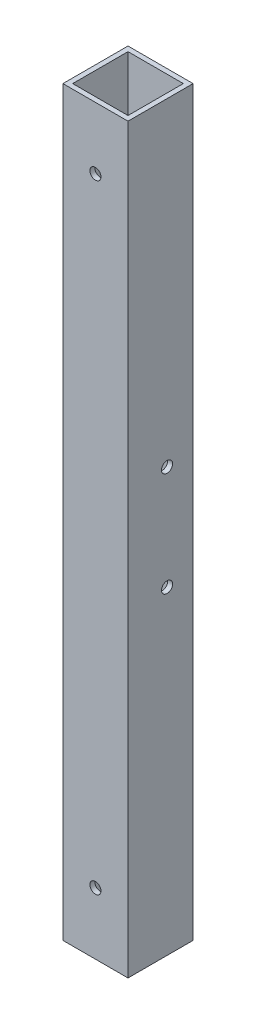
ISO-10303-21;
HEADER;
FILE_DESCRIPTION(('STEP AP214'),'2;1');
FILE_NAME('part.step','',(''),(''),'','','');
FILE_SCHEMA(('AUTOMOTIVE_DESIGN { 1 0 10303 214 1 1 1 1 }'));
ENDSEC;
DATA;
#1=APPLICATION_CONTEXT('core data for automotive mechanical design processes');
#2=APPLICATION_PROTOCOL_DEFINITION('international standard','automotive_design',2000,#1);
#3=PRODUCT_CONTEXT('',#1,'mechanical');
#4=PRODUCT('Part','Part','',(#3));
#5=PRODUCT_RELATED_PRODUCT_CATEGORY('part','',(#4));
#6=PRODUCT_DEFINITION_FORMATION('','',#4);
#7=PRODUCT_DEFINITION_CONTEXT('part definition',#1,'design');
#8=PRODUCT_DEFINITION('design','',#6,#7);
#9=PRODUCT_DEFINITION_SHAPE('','',#8);
#10=(LENGTH_UNIT() NAMED_UNIT(*) SI_UNIT(.MILLI.,.METRE.));
#11=(NAMED_UNIT(*) PLANE_ANGLE_UNIT() SI_UNIT($,.RADIAN.));
#12=(NAMED_UNIT(*) SI_UNIT($,.STERADIAN.) SOLID_ANGLE_UNIT());
#13=UNCERTAINTY_MEASURE_WITH_UNIT(LENGTH_MEASURE(1.E-05),#10,'distance_accuracy_value','');
#14=(GEOMETRIC_REPRESENTATION_CONTEXT(3) GLOBAL_UNCERTAINTY_ASSIGNED_CONTEXT((#13)) GLOBAL_UNIT_ASSIGNED_CONTEXT((#10,
#11,#12)) REPRESENTATION_CONTEXT('',''));
#15=CARTESIAN_POINT('',(0.,0.,0.));
#16=DIRECTION('',(0.,0.,1.));
#17=DIRECTION('',(1.,0.,0.));
#18=AXIS2_PLACEMENT_3D('',#15,#16,#17);
#19=CARTESIAN_POINT('',(-12.,-16.,-2.));
#20=DIRECTION('',(1.,0.,0.));
#21=DIRECTION('',(0.,0.,-1.));
#22=AXIS2_PLACEMENT_3D('',#19,#20,#21);
#23=CYLINDRICAL_SURFACE('',#22,1.7);
#24=DIRECTION('',(1.,0.,0.));
#25=VECTOR('',#24,1.);
#26=CARTESIAN_POINT('',(-12.,-16.,-3.7));
#27=LINE('',#26,#25);
#28=CARTESIAN_POINT('',(8.5,-16.,-3.7));
#29=VERTEX_POINT('',#28);
#30=CARTESIAN_POINT('',(10.,-16.,-3.7));
#31=VERTEX_POINT('',#30);
#32=EDGE_CURVE('E9',#29,#31,#27,.T.);
#33=ORIENTED_EDGE('',*,*,#32,.F.);
#34=CARTESIAN_POINT('',(8.5,-16.,-2.));
#35=DIRECTION('',(1.,0.,0.));
#36=DIRECTION('',(0.,0.,-1.));
#37=AXIS2_PLACEMENT_3D('',#34,#35,#36);
#38=CIRCLE('',#37,1.7);
#39=EDGE_CURVE('E225',#29,#29,#38,.T.);
#40=ORIENTED_EDGE('',*,*,#39,.F.);
#41=ORIENTED_EDGE('',*,*,#32,.T.);
#42=CARTESIAN_POINT('',(10.,-16.,-2.));
#43=DIRECTION('',(1.,0.,0.));
#44=DIRECTION('',(0.,0.,-1.));
#45=AXIS2_PLACEMENT_3D('',#42,#43,#44);
#46=CIRCLE('',#45,1.7);
#47=EDGE_CURVE('E277',#31,#31,#46,.T.);
#48=ORIENTED_EDGE('',*,*,#47,.T.);
#49=EDGE_LOOP('',(#33,#40,#41,#48));
#50=FACE_BOUND('',#49,.T.);
#51=ADVANCED_FACE('F14',(#50),#23,.F.);
#52=CARTESIAN_POINT('',(-12.,16.,-2.));
#53=DIRECTION('',(1.,0.,0.));
#54=DIRECTION('',(0.,0.,-1.));
#55=AXIS2_PLACEMENT_3D('',#52,#53,#54);
#56=CYLINDRICAL_SURFACE('',#55,1.7);
#57=DIRECTION('',(1.,0.,0.));
#58=VECTOR('',#57,1.);
#59=CARTESIAN_POINT('',(-12.,16.,-3.7));
#60=LINE('',#59,#58);
#61=CARTESIAN_POINT('',(8.5,16.,-3.7));
#62=VERTEX_POINT('',#61);
#63=CARTESIAN_POINT('',(10.,16.,-3.7));
#64=VERTEX_POINT('',#63);
#65=EDGE_CURVE('E24',#62,#64,#60,.T.);
#66=ORIENTED_EDGE('',*,*,#65,.F.);
#67=CARTESIAN_POINT('',(8.5,16.,-2.));
#68=DIRECTION('',(1.,0.,0.));
#69=DIRECTION('',(0.,0.,-1.));
#70=AXIS2_PLACEMENT_3D('',#67,#68,#69);
#71=CIRCLE('',#70,1.7);
#72=EDGE_CURVE('E153',#62,#62,#71,.T.);
#73=ORIENTED_EDGE('',*,*,#72,.F.);
#74=ORIENTED_EDGE('',*,*,#65,.T.);
#75=CARTESIAN_POINT('',(10.,16.,-2.));
#76=DIRECTION('',(1.,0.,0.));
#77=DIRECTION('',(0.,0.,-1.));
#78=AXIS2_PLACEMENT_3D('',#75,#76,#77);
#79=CIRCLE('',#78,1.7);
#80=EDGE_CURVE('E235',#64,#64,#79,.T.);
#81=ORIENTED_EDGE('',*,*,#80,.T.);
#82=EDGE_LOOP('',(#66,#73,#74,#81));
#83=FACE_BOUND('',#82,.T.);
#84=ADVANCED_FACE('F368',(#83),#56,.F.);
#85=CARTESIAN_POINT('',(0.,95.,-11.));
#86=DIRECTION('',(0.,0.,1.));
#87=DIRECTION('',(1.,0.,0.));
#88=AXIS2_PLACEMENT_3D('',#85,#86,#87);
#89=CYLINDRICAL_SURFACE('',#88,1.7);
#90=DIRECTION('',(0.,0.,1.));
#91=VECTOR('',#90,1.);
#92=CARTESIAN_POINT('',(1.7,95.,-11.));
#93=LINE('',#92,#91);
#94=CARTESIAN_POINT('',(1.7,95.,8.5));
#95=VERTEX_POINT('',#94);
#96=CARTESIAN_POINT('',(1.7,95.,10.));
#97=VERTEX_POINT('',#96);
#98=EDGE_CURVE('E202',#95,#97,#93,.T.);
#99=ORIENTED_EDGE('',*,*,#98,.F.);
#100=CARTESIAN_POINT('',(0.,95.,8.5));
#101=DIRECTION('',(0.,0.,1.));
#102=DIRECTION('',(1.,0.,0.));
#103=AXIS2_PLACEMENT_3D('',#100,#101,#102);
#104=CIRCLE('',#103,1.7);
#105=EDGE_CURVE('E173',#95,#95,#104,.T.);
#106=ORIENTED_EDGE('',*,*,#105,.F.);
#107=ORIENTED_EDGE('',*,*,#98,.T.);
#108=CARTESIAN_POINT('',(0.,95.,10.));
#109=DIRECTION('',(0.,0.,1.));
#110=DIRECTION('',(1.,0.,0.));
#111=AXIS2_PLACEMENT_3D('',#108,#109,#110);
#112=CIRCLE('',#111,1.7);
#113=EDGE_CURVE('E143',#97,#97,#112,.T.);
#114=ORIENTED_EDGE('',*,*,#113,.T.);
#115=EDGE_LOOP('',(#99,#106,#107,#114));
#116=FACE_BOUND('',#115,.T.);
#117=ADVANCED_FACE('F372',(#116),#89,.F.);
#118=CARTESIAN_POINT('',(0.,-95.,-11.));
#119=DIRECTION('',(0.,0.,1.));
#120=DIRECTION('',(1.,0.,0.));
#121=AXIS2_PLACEMENT_3D('',#118,#119,#120);
#122=CYLINDRICAL_SURFACE('',#121,1.7);
#123=DIRECTION('',(0.,0.,1.));
#124=VECTOR('',#123,1.);
#125=CARTESIAN_POINT('',(1.7,-95.,-11.));
#126=LINE('',#125,#124);
#127=CARTESIAN_POINT('',(1.7,-95.,8.5));
#128=VERTEX_POINT('',#127);
#129=CARTESIAN_POINT('',(1.7,-95.,10.));
#130=VERTEX_POINT('',#129);
#131=EDGE_CURVE('E198',#128,#130,#126,.T.);
#132=ORIENTED_EDGE('',*,*,#131,.F.);
#133=CARTESIAN_POINT('',(0.,-95.,8.5));
#134=DIRECTION('',(0.,0.,1.));
#135=DIRECTION('',(1.,0.,0.));
#136=AXIS2_PLACEMENT_3D('',#133,#134,#135);
#137=CIRCLE('',#136,1.7);
#138=EDGE_CURVE('E119',#128,#128,#137,.T.);
#139=ORIENTED_EDGE('',*,*,#138,.F.);
#140=ORIENTED_EDGE('',*,*,#131,.T.);
#141=CARTESIAN_POINT('',(0.,-95.,10.));
#142=DIRECTION('',(0.,0.,1.));
#143=DIRECTION('',(1.,0.,0.));
#144=AXIS2_PLACEMENT_3D('',#141,#142,#143);
#145=CIRCLE('',#144,1.7);
#146=EDGE_CURVE('E182',#130,#130,#145,.T.);
#147=ORIENTED_EDGE('',*,*,#146,.T.);
#148=EDGE_LOOP('',(#132,#139,#140,#147));
#149=FACE_BOUND('',#148,.T.);
#150=ADVANCED_FACE('F352',(#149),#122,.F.);
#151=CARTESIAN_POINT('',(0.,95.,-11.));
#152=DIRECTION('',(0.,0.,1.));
#153=DIRECTION('',(1.,0.,0.));
#154=AXIS2_PLACEMENT_3D('',#151,#152,#153);
#155=CYLINDRICAL_SURFACE('',#154,1.7);
#156=DIRECTION('',(0.,0.,1.));
#157=VECTOR('',#156,1.);
#158=CARTESIAN_POINT('',(1.7,95.,-11.));
#159=LINE('',#158,#157);
#160=CARTESIAN_POINT('',(1.7,95.,-10.));
#161=VERTEX_POINT('',#160);
#162=CARTESIAN_POINT('',(1.7,95.,-8.5));
#163=VERTEX_POINT('',#162);
#164=EDGE_CURVE('E195',#161,#163,#159,.T.);
#165=ORIENTED_EDGE('',*,*,#164,.F.);
#166=CARTESIAN_POINT('',(0.,95.,-10.));
#167=DIRECTION('',(0.,0.,1.));
#168=DIRECTION('',(1.,0.,0.));
#169=AXIS2_PLACEMENT_3D('',#166,#167,#168);
#170=CIRCLE('',#169,1.7);
#171=EDGE_CURVE('E274',#161,#161,#170,.T.);
#172=ORIENTED_EDGE('',*,*,#171,.F.);
#173=ORIENTED_EDGE('',*,*,#164,.T.);
#174=CARTESIAN_POINT('',(0.,95.,-8.5));
#175=DIRECTION('',(0.,0.,1.));
#176=DIRECTION('',(1.,0.,0.));
#177=AXIS2_PLACEMENT_3D('',#174,#175,#176);
#178=CIRCLE('',#177,1.7);
#179=EDGE_CURVE('E149',#163,#163,#178,.T.);
#180=ORIENTED_EDGE('',*,*,#179,.T.);
#181=EDGE_LOOP('',(#165,#172,#173,#180));
#182=FACE_BOUND('',#181,.T.);
#183=ADVANCED_FACE('F393',(#182),#155,.F.);
#184=CARTESIAN_POINT('',(0.,-95.,-11.));
#185=DIRECTION('',(0.,0.,1.));
#186=DIRECTION('',(1.,0.,0.));
#187=AXIS2_PLACEMENT_3D('',#184,#185,#186);
#188=CYLINDRICAL_SURFACE('',#187,1.7);
#189=DIRECTION('',(0.,0.,1.));
#190=VECTOR('',#189,1.);
#191=CARTESIAN_POINT('',(1.7,-95.,-11.));
#192=LINE('',#191,#190);
#193=CARTESIAN_POINT('',(1.7,-95.,-10.));
#194=VERTEX_POINT('',#193);
#195=CARTESIAN_POINT('',(1.7,-95.,-8.5));
#196=VERTEX_POINT('',#195);
#197=EDGE_CURVE('E199',#194,#196,#192,.T.);
#198=ORIENTED_EDGE('',*,*,#197,.F.);
#199=CARTESIAN_POINT('',(0.,-95.,-10.));
#200=DIRECTION('',(0.,0.,1.));
#201=DIRECTION('',(1.,0.,0.));
#202=AXIS2_PLACEMENT_3D('',#199,#200,#201);
#203=CIRCLE('',#202,1.7);
#204=EDGE_CURVE('E187',#194,#194,#203,.T.);
#205=ORIENTED_EDGE('',*,*,#204,.F.);
#206=ORIENTED_EDGE('',*,*,#197,.T.);
#207=CARTESIAN_POINT('',(0.,-95.,-8.5));
#208=DIRECTION('',(0.,0.,1.));
#209=DIRECTION('',(1.,0.,0.));
#210=AXIS2_PLACEMENT_3D('',#207,#208,#209);
#211=CIRCLE('',#210,1.7);
#212=EDGE_CURVE('E154',#196,#196,#211,.T.);
#213=ORIENTED_EDGE('',*,*,#212,.T.);
#214=EDGE_LOOP('',(#198,#205,#206,#213));
#215=FACE_BOUND('',#214,.T.);
#216=ADVANCED_FACE('F386',(#215),#188,.F.);
#217=CARTESIAN_POINT('',(8.5,-114.5,-8.5));
#218=DIRECTION('',(1.,0.,0.));
#219=DIRECTION('',(0.,1.,0.));
#220=AXIS2_PLACEMENT_3D('',#217,#218,#219);
#221=PLANE('',#220);
#222=ORIENTED_EDGE('',*,*,#39,.T.);
#223=EDGE_LOOP('',(#222));
#224=FACE_BOUND('',#223,.T.);
#225=ORIENTED_EDGE('',*,*,#72,.T.);
#226=EDGE_LOOP('',(#225));
#227=FACE_BOUND('',#226,.T.);
#228=DIRECTION('',(0.,0.,-1.));
#229=VECTOR('',#228,1.);
#230=CARTESIAN_POINT('',(8.5,114.,-9.25));
#231=LINE('',#230,#229);
#232=CARTESIAN_POINT('',(8.5,114.,8.5));
#233=VERTEX_POINT('',#232);
#234=CARTESIAN_POINT('',(8.5,114.,-8.5));
#235=VERTEX_POINT('',#234);
#236=EDGE_CURVE('E134',#233,#235,#231,.T.);
#237=ORIENTED_EDGE('',*,*,#236,.T.);
#238=DIRECTION('',(0.,1.,0.));
#239=VECTOR('',#238,1.);
#240=CARTESIAN_POINT('',(8.5,-114.5,-8.5));
#241=LINE('',#240,#239);
#242=CARTESIAN_POINT('',(8.5,-114.,-8.5));
#243=VERTEX_POINT('',#242);
#244=EDGE_CURVE('E172',#243,#235,#241,.T.);
#245=ORIENTED_EDGE('',*,*,#244,.F.);
#246=DIRECTION('',(0.,0.,-1.));
#247=VECTOR('',#246,1.);
#248=CARTESIAN_POINT('',(8.5,-114.,-9.25));
#249=LINE('',#248,#247);
#250=CARTESIAN_POINT('',(8.5,-114.,8.5));
#251=VERTEX_POINT('',#250);
#252=EDGE_CURVE('E178',#251,#243,#249,.T.);
#253=ORIENTED_EDGE('',*,*,#252,.F.);
#254=DIRECTION('',(0.,1.,0.));
#255=VECTOR('',#254,1.);
#256=CARTESIAN_POINT('',(8.5,-114.5,8.5));
#257=LINE('',#256,#255);
#258=EDGE_CURVE('E99',#251,#233,#257,.T.);
#259=ORIENTED_EDGE('',*,*,#258,.T.);
#260=EDGE_LOOP('',(#237,#245,#253,#259));
#261=FACE_BOUND('',#260,.T.);
#262=ADVANCED_FACE('F383',(#224,#227,#261),#221,.F.);
#263=CARTESIAN_POINT('',(-8.5,-114.5,-8.5));
#264=DIRECTION('',(0.,0.,1.));
#265=DIRECTION('',(1.,0.,0.));
#266=AXIS2_PLACEMENT_3D('',#263,#264,#265);
#267=PLANE('',#266);
#268=ORIENTED_EDGE('',*,*,#179,.F.);
#269=EDGE_LOOP('',(#268));
#270=FACE_BOUND('',#269,.T.);
#271=ORIENTED_EDGE('',*,*,#212,.F.);
#272=EDGE_LOOP('',(#271));
#273=FACE_BOUND('',#272,.T.);
#274=DIRECTION('',(0.,1.,0.));
#275=VECTOR('',#274,1.);
#276=CARTESIAN_POINT('',(-8.5,-114.5,-8.5));
#277=LINE('',#276,#275);
#278=CARTESIAN_POINT('',(-8.5,-114.,-8.5));
#279=VERTEX_POINT('',#278);
#280=CARTESIAN_POINT('',(-8.5,114.,-8.5));
#281=VERTEX_POINT('',#280);
#282=EDGE_CURVE('E125',#279,#281,#277,.T.);
#283=ORIENTED_EDGE('',*,*,#282,.F.);
#284=DIRECTION('',(1.,0.,0.));
#285=VECTOR('',#284,1.);
#286=CARTESIAN_POINT('',(-9.25,-114.,-8.5));
#287=LINE('',#286,#285);
#288=EDGE_CURVE('E241',#279,#243,#287,.T.);
#289=ORIENTED_EDGE('',*,*,#288,.T.);
#290=ORIENTED_EDGE('',*,*,#244,.T.);
#291=DIRECTION('',(1.,0.,0.));
#292=VECTOR('',#291,1.);
#293=CARTESIAN_POINT('',(-9.25,114.,-8.5));
#294=LINE('',#293,#292);
#295=EDGE_CURVE('E130',#281,#235,#294,.T.);
#296=ORIENTED_EDGE('',*,*,#295,.F.);
#297=EDGE_LOOP('',(#283,#289,#290,#296));
#298=FACE_BOUND('',#297,.T.);
#299=ADVANCED_FACE('F362',(#270,#273,#298),#267,.T.);
#300=CARTESIAN_POINT('',(-8.5,-114.5,-8.5));
#301=DIRECTION('',(1.,0.,0.));
#302=DIRECTION('',(0.,1.,0.));
#303=AXIS2_PLACEMENT_3D('',#300,#301,#302);
#304=PLANE('',#303);
#305=CARTESIAN_POINT('',(-8.5,-16.,-2.));
#306=DIRECTION('',(1.,0.,0.));
#307=DIRECTION('',(0.,0.,-1.));
#308=AXIS2_PLACEMENT_3D('',#305,#306,#307);
#309=CIRCLE('',#308,1.7);
#310=CARTESIAN_POINT('',(-8.5,-16.,-3.7));
#311=VERTEX_POINT('',#310);
#312=EDGE_CURVE('E162',#311,#311,#309,.T.);
#313=ORIENTED_EDGE('',*,*,#312,.F.);
#314=EDGE_LOOP('',(#313));
#315=FACE_BOUND('',#314,.T.);
#316=CARTESIAN_POINT('',(-8.5,16.,-2.));
#317=DIRECTION('',(1.,0.,0.));
#318=DIRECTION('',(0.,0.,-1.));
#319=AXIS2_PLACEMENT_3D('',#316,#317,#318);
#320=CIRCLE('',#319,1.7);
#321=CARTESIAN_POINT('',(-8.5,16.,-3.7));
#322=VERTEX_POINT('',#321);
#323=EDGE_CURVE('E163',#322,#322,#320,.T.);
#324=ORIENTED_EDGE('',*,*,#323,.F.);
#325=EDGE_LOOP('',(#324));
#326=FACE_BOUND('',#325,.T.);
#327=DIRECTION('',(0.,1.,0.));
#328=VECTOR('',#327,1.);
#329=CARTESIAN_POINT('',(-8.5,-114.5,8.5));
#330=LINE('',#329,#328);
#331=CARTESIAN_POINT('',(-8.5,-114.,8.5));
#332=VERTEX_POINT('',#331);
#333=CARTESIAN_POINT('',(-8.5,114.,8.5));
#334=VERTEX_POINT('',#333);
#335=EDGE_CURVE('E108',#332,#334,#330,.T.);
#336=ORIENTED_EDGE('',*,*,#335,.F.);
#337=DIRECTION('',(0.,0.,-1.));
#338=VECTOR('',#337,1.);
#339=CARTESIAN_POINT('',(-8.5,-114.,-9.25));
#340=LINE('',#339,#338);
#341=EDGE_CURVE('E218',#332,#279,#340,.T.);
#342=ORIENTED_EDGE('',*,*,#341,.T.);
#343=ORIENTED_EDGE('',*,*,#282,.T.);
#344=DIRECTION('',(0.,0.,-1.));
#345=VECTOR('',#344,1.);
#346=CARTESIAN_POINT('',(-8.5,114.,-9.25));
#347=LINE('',#346,#345);
#348=EDGE_CURVE('E122',#334,#281,#347,.T.);
#349=ORIENTED_EDGE('',*,*,#348,.F.);
#350=EDGE_LOOP('',(#336,#342,#343,#349));
#351=FACE_BOUND('',#350,.T.);
#352=ADVANCED_FACE('F123',(#315,#326,#351),#304,.T.);
#353=CARTESIAN_POINT('',(-8.5,-114.5,8.5));
#354=DIRECTION('',(0.,0.,1.));
#355=DIRECTION('',(1.,0.,0.));
#356=AXIS2_PLACEMENT_3D('',#353,#354,#355);
#357=PLANE('',#356);
#358=ORIENTED_EDGE('',*,*,#105,.T.);
#359=EDGE_LOOP('',(#358));
#360=FACE_BOUND('',#359,.T.);
#361=ORIENTED_EDGE('',*,*,#138,.T.);
#362=EDGE_LOOP('',(#361));
#363=FACE_BOUND('',#362,.T.);
#364=DIRECTION('',(1.,0.,0.));
#365=VECTOR('',#364,1.);
#366=CARTESIAN_POINT('',(-9.25,114.,8.5));
#367=LINE('',#366,#365);
#368=EDGE_CURVE('E112',#334,#233,#367,.T.);
#369=ORIENTED_EDGE('',*,*,#368,.T.);
#370=ORIENTED_EDGE('',*,*,#258,.F.);
#371=DIRECTION('',(1.,0.,0.));
#372=VECTOR('',#371,1.);
#373=CARTESIAN_POINT('',(-9.25,-114.,8.5));
#374=LINE('',#373,#372);
#375=EDGE_CURVE('E114',#332,#251,#374,.T.);
#376=ORIENTED_EDGE('',*,*,#375,.F.);
#377=ORIENTED_EDGE('',*,*,#335,.T.);
#378=EDGE_LOOP('',(#369,#370,#376,#377));
#379=FACE_BOUND('',#378,.T.);
#380=ADVANCED_FACE('F110',(#360,#363,#379),#357,.F.);
#381=CARTESIAN_POINT('',(10.,-114.,-10.));
#382=DIRECTION('',(1.,0.,0.));
#383=DIRECTION('',(0.,1.,0.));
#384=AXIS2_PLACEMENT_3D('',#381,#382,#383);
#385=PLANE('',#384);
#386=ORIENTED_EDGE('',*,*,#47,.F.);
#387=EDGE_LOOP('',(#386));
#388=FACE_BOUND('',#387,.T.);
#389=ORIENTED_EDGE('',*,*,#80,.F.);
#390=EDGE_LOOP('',(#389));
#391=FACE_BOUND('',#390,.T.);
#392=DIRECTION('',(0.,0.,1.));
#393=VECTOR('',#392,1.);
#394=CARTESIAN_POINT('',(10.,-114.,-10.));
#395=LINE('',#394,#393);
#396=CARTESIAN_POINT('',(10.,-114.,-10.));
#397=VERTEX_POINT('',#396);
#398=CARTESIAN_POINT('',(10.,-114.,10.));
#399=VERTEX_POINT('',#398);
#400=EDGE_CURVE('E192',#397,#399,#395,.T.);
#401=ORIENTED_EDGE('',*,*,#400,.F.);
#402=DIRECTION('',(0.,1.,0.));
#403=VECTOR('',#402,1.);
#404=CARTESIAN_POINT('',(10.,-114.,-10.));
#405=LINE('',#404,#403);
#406=CARTESIAN_POINT('',(10.,114.,-10.));
#407=VERTEX_POINT('',#406);
#408=EDGE_CURVE('E183',#397,#407,#405,.T.);
#409=ORIENTED_EDGE('',*,*,#408,.T.);
#410=DIRECTION('',(0.,0.,1.));
#411=VECTOR('',#410,1.);
#412=CARTESIAN_POINT('',(10.,114.,-10.));
#413=LINE('',#412,#411);
#414=CARTESIAN_POINT('',(10.,114.,10.));
#415=VERTEX_POINT('',#414);
#416=EDGE_CURVE('E136',#407,#415,#413,.T.);
#417=ORIENTED_EDGE('',*,*,#416,.T.);
#418=DIRECTION('',(0.,1.,0.));
#419=VECTOR('',#418,1.);
#420=CARTESIAN_POINT('',(10.,-114.,10.));
#421=LINE('',#420,#419);
#422=EDGE_CURVE('E262',#399,#415,#421,.T.);
#423=ORIENTED_EDGE('',*,*,#422,.F.);
#424=EDGE_LOOP('',(#401,#409,#417,#423));
#425=FACE_BOUND('',#424,.T.);
#426=ADVANCED_FACE('F312',(#388,#391,#425),#385,.T.);
#427=CARTESIAN_POINT('',(-12.,-16.,-2.));
#428=DIRECTION('',(1.,0.,0.));
#429=DIRECTION('',(0.,0.,-1.));
#430=AXIS2_PLACEMENT_3D('',#427,#428,#429);
#431=CYLINDRICAL_SURFACE('',#430,1.7);
#432=DIRECTION('',(1.,0.,0.));
#433=VECTOR('',#432,1.);
#434=CARTESIAN_POINT('',(-12.,-16.,-3.7));
#435=LINE('',#434,#433);
#436=CARTESIAN_POINT('',(-10.,-16.,-3.7));
#437=VERTEX_POINT('',#436);
#438=EDGE_CURVE('E158',#437,#311,#435,.T.);
#439=ORIENTED_EDGE('',*,*,#438,.F.);
#440=CARTESIAN_POINT('',(-10.,-16.,-2.));
#441=DIRECTION('',(1.,0.,0.));
#442=DIRECTION('',(0.,0.,-1.));
#443=AXIS2_PLACEMENT_3D('',#440,#441,#442);
#444=CIRCLE('',#443,1.7);
#445=EDGE_CURVE('E189',#437,#437,#444,.T.);
#446=ORIENTED_EDGE('',*,*,#445,.F.);
#447=ORIENTED_EDGE('',*,*,#438,.T.);
#448=ORIENTED_EDGE('',*,*,#312,.T.);
#449=EDGE_LOOP('',(#439,#446,#447,#448));
#450=FACE_BOUND('',#449,.T.);
#451=ADVANCED_FACE('F315',(#450),#431,.F.);
#452=CARTESIAN_POINT('',(-12.,16.,-2.));
#453=DIRECTION('',(1.,0.,0.));
#454=DIRECTION('',(0.,0.,-1.));
#455=AXIS2_PLACEMENT_3D('',#452,#453,#454);
#456=CYLINDRICAL_SURFACE('',#455,1.7);
#457=DIRECTION('',(1.,0.,0.));
#458=VECTOR('',#457,1.);
#459=CARTESIAN_POINT('',(-12.,16.,-3.7));
#460=LINE('',#459,#458);
#461=CARTESIAN_POINT('',(-10.,16.,-3.7));
#462=VERTEX_POINT('',#461);
#463=EDGE_CURVE('E157',#462,#322,#460,.T.);
#464=ORIENTED_EDGE('',*,*,#463,.F.);
#465=CARTESIAN_POINT('',(-10.,16.,-2.));
#466=DIRECTION('',(1.,0.,0.));
#467=DIRECTION('',(0.,0.,-1.));
#468=AXIS2_PLACEMENT_3D('',#465,#466,#467);
#469=CIRCLE('',#468,1.7);
#470=EDGE_CURVE('E193',#462,#462,#469,.T.);
#471=ORIENTED_EDGE('',*,*,#470,.F.);
#472=ORIENTED_EDGE('',*,*,#463,.T.);
#473=ORIENTED_EDGE('',*,*,#323,.T.);
#474=EDGE_LOOP('',(#464,#471,#472,#473));
#475=FACE_BOUND('',#474,.T.);
#476=ADVANCED_FACE('F380',(#475),#456,.F.);
#477=CARTESIAN_POINT('',(-10.,114.,-10.));
#478=DIRECTION('',(0.,1.,0.));
#479=DIRECTION('',(1.,0.,0.));
#480=AXIS2_PLACEMENT_3D('',#477,#478,#479);
#481=PLANE('',#480);
#482=ORIENTED_EDGE('',*,*,#368,.F.);
#483=ORIENTED_EDGE('',*,*,#348,.T.);
#484=ORIENTED_EDGE('',*,*,#295,.T.);
#485=ORIENTED_EDGE('',*,*,#236,.F.);
#486=EDGE_LOOP('',(#482,#483,#484,#485));
#487=FACE_BOUND('',#486,.T.);
#488=DIRECTION('',(1.,0.,0.));
#489=VECTOR('',#488,1.);
#490=CARTESIAN_POINT('',(-10.,114.,-10.));
#491=LINE('',#490,#489);
#492=CARTESIAN_POINT('',(-10.,114.,-10.));
#493=VERTEX_POINT('',#492);
#494=EDGE_CURVE('E188',#493,#407,#491,.T.);
#495=ORIENTED_EDGE('',*,*,#494,.F.);
#496=DIRECTION('',(0.,0.,1.));
#497=VECTOR('',#496,1.);
#498=CARTESIAN_POINT('',(-10.,114.,-10.));
#499=LINE('',#498,#497);
#500=CARTESIAN_POINT('',(-10.,114.,10.));
#501=VERTEX_POINT('',#500);
#502=EDGE_CURVE('E164',#493,#501,#499,.T.);
#503=ORIENTED_EDGE('',*,*,#502,.T.);
#504=DIRECTION('',(1.,0.,0.));
#505=VECTOR('',#504,1.);
#506=CARTESIAN_POINT('',(-10.,114.,10.));
#507=LINE('',#506,#505);
#508=EDGE_CURVE('E209',#501,#415,#507,.T.);
#509=ORIENTED_EDGE('',*,*,#508,.T.);
#510=ORIENTED_EDGE('',*,*,#416,.F.);
#511=EDGE_LOOP('',(#495,#503,#509,#510));
#512=FACE_BOUND('',#511,.T.);
#513=ADVANCED_FACE('F132',(#487,#512),#481,.T.);
#514=CARTESIAN_POINT('',(-10.,-114.,10.));
#515=DIRECTION('',(0.,0.,1.));
#516=DIRECTION('',(1.,0.,0.));
#517=AXIS2_PLACEMENT_3D('',#514,#515,#516);
#518=PLANE('',#517);
#519=ORIENTED_EDGE('',*,*,#113,.F.);
#520=EDGE_LOOP('',(#519));
#521=FACE_BOUND('',#520,.T.);
#522=ORIENTED_EDGE('',*,*,#146,.F.);
#523=EDGE_LOOP('',(#522));
#524=FACE_BOUND('',#523,.T.);
#525=DIRECTION('',(0.,1.,0.));
#526=VECTOR('',#525,1.);
#527=CARTESIAN_POINT('',(-10.,-114.,10.));
#528=LINE('',#527,#526);
#529=CARTESIAN_POINT('',(-10.,-114.,10.));
#530=VERTEX_POINT('',#529);
#531=EDGE_CURVE('E169',#530,#501,#528,.T.);
#532=ORIENTED_EDGE('',*,*,#531,.F.);
#533=DIRECTION('',(1.,0.,0.));
#534=VECTOR('',#533,1.);
#535=CARTESIAN_POINT('',(-10.,-114.,10.));
#536=LINE('',#535,#534);
#537=EDGE_CURVE('E17',#530,#399,#536,.T.);
#538=ORIENTED_EDGE('',*,*,#537,.T.);
#539=ORIENTED_EDGE('',*,*,#422,.T.);
#540=ORIENTED_EDGE('',*,*,#508,.F.);
#541=EDGE_LOOP('',(#532,#538,#539,#540));
#542=FACE_BOUND('',#541,.T.);
#543=ADVANCED_FACE('F388',(#521,#524,#542),#518,.T.);
#544=CARTESIAN_POINT('',(-10.,-114.,-10.));
#545=DIRECTION('',(0.,0.,1.));
#546=DIRECTION('',(1.,0.,0.));
#547=AXIS2_PLACEMENT_3D('',#544,#545,#546);
#548=PLANE('',#547);
#549=ORIENTED_EDGE('',*,*,#171,.T.);
#550=EDGE_LOOP('',(#549));
#551=FACE_BOUND('',#550,.T.);
#552=ORIENTED_EDGE('',*,*,#204,.T.);
#553=EDGE_LOOP('',(#552));
#554=FACE_BOUND('',#553,.T.);
#555=ORIENTED_EDGE('',*,*,#494,.T.);
#556=ORIENTED_EDGE('',*,*,#408,.F.);
#557=DIRECTION('',(1.,0.,0.));
#558=VECTOR('',#557,1.);
#559=CARTESIAN_POINT('',(-10.,-114.,-10.));
#560=LINE('',#559,#558);
#561=CARTESIAN_POINT('',(-10.,-114.,-10.));
#562=VERTEX_POINT('',#561);
#563=EDGE_CURVE('E174',#562,#397,#560,.T.);
#564=ORIENTED_EDGE('',*,*,#563,.F.);
#565=DIRECTION('',(0.,1.,0.));
#566=VECTOR('',#565,1.);
#567=CARTESIAN_POINT('',(-10.,-114.,-10.));
#568=LINE('',#567,#566);
#569=EDGE_CURVE('E168',#562,#493,#568,.T.);
#570=ORIENTED_EDGE('',*,*,#569,.T.);
#571=EDGE_LOOP('',(#555,#556,#564,#570));
#572=FACE_BOUND('',#571,.T.);
#573=ADVANCED_FACE('F390',(#551,#554,#572),#548,.F.);
#574=CARTESIAN_POINT('',(-10.,-114.,-10.));
#575=DIRECTION('',(0.,1.,0.));
#576=DIRECTION('',(1.,0.,0.));
#577=AXIS2_PLACEMENT_3D('',#574,#575,#576);
#578=PLANE('',#577);
#579=ORIENTED_EDGE('',*,*,#252,.T.);
#580=ORIENTED_EDGE('',*,*,#288,.F.);
#581=ORIENTED_EDGE('',*,*,#341,.F.);
#582=ORIENTED_EDGE('',*,*,#375,.T.);
#583=EDGE_LOOP('',(#579,#580,#581,#582));
#584=FACE_BOUND('',#583,.T.);
#585=ORIENTED_EDGE('',*,*,#400,.T.);
#586=ORIENTED_EDGE('',*,*,#537,.F.);
#587=DIRECTION('',(0.,0.,1.));
#588=VECTOR('',#587,1.);
#589=CARTESIAN_POINT('',(-10.,-114.,-10.));
#590=LINE('',#589,#588);
#591=EDGE_CURVE('E284',#562,#530,#590,.T.);
#592=ORIENTED_EDGE('',*,*,#591,.F.);
#593=ORIENTED_EDGE('',*,*,#563,.T.);
#594=EDGE_LOOP('',(#585,#586,#592,#593));
#595=FACE_BOUND('',#594,.T.);
#596=ADVANCED_FACE('F328',(#584,#595),#578,.F.);
#597=CARTESIAN_POINT('',(-10.,-114.,-10.));
#598=DIRECTION('',(1.,0.,0.));
#599=DIRECTION('',(0.,1.,0.));
#600=AXIS2_PLACEMENT_3D('',#597,#598,#599);
#601=PLANE('',#600);
#602=ORIENTED_EDGE('',*,*,#445,.T.);
#603=EDGE_LOOP('',(#602));
#604=FACE_BOUND('',#603,.T.);
#605=ORIENTED_EDGE('',*,*,#470,.T.);
#606=EDGE_LOOP('',(#605));
#607=FACE_BOUND('',#606,.T.);
#608=ORIENTED_EDGE('',*,*,#531,.T.);
#609=ORIENTED_EDGE('',*,*,#502,.F.);
#610=ORIENTED_EDGE('',*,*,#569,.F.);
#611=ORIENTED_EDGE('',*,*,#591,.T.);
#612=EDGE_LOOP('',(#608,#609,#610,#611));
#613=FACE_BOUND('',#612,.T.);
#614=ADVANCED_FACE('F397',(#604,#607,#613),#601,.F.);
#615=CLOSED_SHELL('',(#51,#84,#117,#150,#183,#216,#262,#299,#352,#380,#426,#451,#476,#513,#543,
#573,#596,#614));
#616=MANIFOLD_SOLID_BREP('B1',#615);
#617=ADVANCED_BREP_SHAPE_REPRESENTATION('',(#18,#616),#14);
#618=SHAPE_DEFINITION_REPRESENTATION(#9,#617);
ENDSEC;
END-ISO-10303-21;
